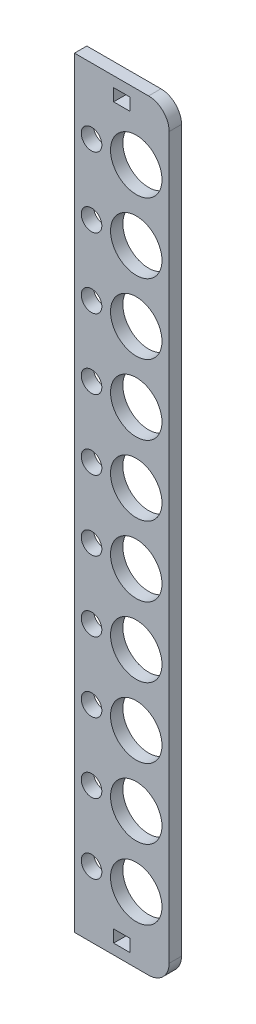
ISO-10303-21;
HEADER;
FILE_DESCRIPTION(('STEP AP214'),'2;1');
FILE_NAME('part.step','',(''),(''),'','','');
FILE_SCHEMA(('AUTOMOTIVE_DESIGN { 1 0 10303 214 1 1 1 1 }'));
ENDSEC;
DATA;
#1=APPLICATION_CONTEXT('core data for automotive mechanical design processes');
#2=APPLICATION_PROTOCOL_DEFINITION('international standard','automotive_design',2000,#1);
#3=PRODUCT_CONTEXT('',#1,'mechanical');
#4=PRODUCT('Part','Part','',(#3));
#5=PRODUCT_RELATED_PRODUCT_CATEGORY('part','',(#4));
#6=PRODUCT_DEFINITION_FORMATION('','',#4);
#7=PRODUCT_DEFINITION_CONTEXT('part definition',#1,'design');
#8=PRODUCT_DEFINITION('design','',#6,#7);
#9=PRODUCT_DEFINITION_SHAPE('','',#8);
#10=(LENGTH_UNIT() NAMED_UNIT(*) SI_UNIT(.MILLI.,.METRE.));
#11=(NAMED_UNIT(*) PLANE_ANGLE_UNIT() SI_UNIT($,.RADIAN.));
#12=(NAMED_UNIT(*) SI_UNIT($,.STERADIAN.) SOLID_ANGLE_UNIT());
#13=UNCERTAINTY_MEASURE_WITH_UNIT(LENGTH_MEASURE(1.E-05),#10,'distance_accuracy_value','');
#14=(GEOMETRIC_REPRESENTATION_CONTEXT(3) GLOBAL_UNCERTAINTY_ASSIGNED_CONTEXT((#13)) GLOBAL_UNIT_ASSIGNED_CONTEXT((#10,
#11,#12)) REPRESENTATION_CONTEXT('',''));
#15=CARTESIAN_POINT('',(0.,0.,0.));
#16=DIRECTION('',(0.,0.,1.));
#17=DIRECTION('',(1.,0.,0.));
#18=AXIS2_PLACEMENT_3D('',#15,#16,#17);
#19=CARTESIAN_POINT('',(0.,0.,6.));
#20=DIRECTION('',(0.,0.,-1.));
#21=DIRECTION('',(-1.,0.,0.));
#22=AXIS2_PLACEMENT_3D('',#19,#20,#21);
#23=PLANE('',#22);
#24=CARTESIAN_POINT('',(8.28114320263769,32.,6.));
#25=DIRECTION('',(0.,0.,1.));
#26=DIRECTION('',(1.,0.,0.));
#27=AXIS2_PLACEMENT_3D('',#24,#25,#26);
#28=CIRCLE('',#27,4.99999999999999);
#29=CARTESIAN_POINT('',(13.2811432026377,32.,6.));
#30=VERTEX_POINT('',#29);
#31=EDGE_CURVE('E607',#30,#30,#28,.T.);
#32=ORIENTED_EDGE('',*,*,#31,.F.);
#33=EDGE_LOOP('',(#32));
#34=FACE_BOUND('',#33,.T.);
#35=CARTESIAN_POINT('',(8.28114320263733,66.,6.));
#36=DIRECTION('',(0.,0.,1.));
#37=DIRECTION('',(1.,0.,0.));
#38=AXIS2_PLACEMENT_3D('',#35,#36,#37);
#39=CIRCLE('',#38,4.99999999999999);
#40=CARTESIAN_POINT('',(13.2811432026373,66.,6.));
#41=VERTEX_POINT('',#40);
#42=EDGE_CURVE('E609',#41,#41,#39,.T.);
#43=ORIENTED_EDGE('',*,*,#42,.F.);
#44=EDGE_LOOP('',(#43));
#45=FACE_BOUND('',#44,.T.);
#46=CARTESIAN_POINT('',(8.28114320263698,100.,6.));
#47=DIRECTION('',(0.,0.,1.));
#48=DIRECTION('',(1.,0.,0.));
#49=AXIS2_PLACEMENT_3D('',#46,#47,#48);
#50=CIRCLE('',#49,5.);
#51=CARTESIAN_POINT('',(13.281143202637,100.,6.));
#52=VERTEX_POINT('',#51);
#53=EDGE_CURVE('E615',#52,#52,#50,.T.);
#54=ORIENTED_EDGE('',*,*,#53,.F.);
#55=EDGE_LOOP('',(#54));
#56=FACE_BOUND('',#55,.T.);
#57=CARTESIAN_POINT('',(8.28114320263662,134.,6.));
#58=DIRECTION('',(0.,0.,1.));
#59=DIRECTION('',(1.,0.,0.));
#60=AXIS2_PLACEMENT_3D('',#57,#58,#59);
#61=CIRCLE('',#60,5.);
#62=CARTESIAN_POINT('',(13.2811432026366,134.,6.));
#63=VERTEX_POINT('',#62);
#64=EDGE_CURVE('E621',#63,#63,#61,.T.);
#65=ORIENTED_EDGE('',*,*,#64,.F.);
#66=EDGE_LOOP('',(#65));
#67=FACE_BOUND('',#66,.T.);
#68=CARTESIAN_POINT('',(8.28114320263627,168.,6.));
#69=DIRECTION('',(0.,0.,1.));
#70=DIRECTION('',(1.,0.,0.));
#71=AXIS2_PLACEMENT_3D('',#68,#69,#70);
#72=CIRCLE('',#71,5.);
#73=CARTESIAN_POINT('',(13.2811432026363,168.,6.));
#74=VERTEX_POINT('',#73);
#75=EDGE_CURVE('E627',#74,#74,#72,.T.);
#76=ORIENTED_EDGE('',*,*,#75,.F.);
#77=EDGE_LOOP('',(#76));
#78=FACE_BOUND('',#77,.T.);
#79=CARTESIAN_POINT('',(8.28114320263591,202.,6.));
#80=DIRECTION('',(0.,0.,1.));
#81=DIRECTION('',(1.,0.,0.));
#82=AXIS2_PLACEMENT_3D('',#79,#80,#81);
#83=CIRCLE('',#82,5.);
#84=CARTESIAN_POINT('',(13.2811432026359,202.,6.));
#85=VERTEX_POINT('',#84);
#86=EDGE_CURVE('E633',#85,#85,#83,.T.);
#87=ORIENTED_EDGE('',*,*,#86,.F.);
#88=EDGE_LOOP('',(#87));
#89=FACE_BOUND('',#88,.T.);
#90=CARTESIAN_POINT('',(8.28114320263555,236.,6.));
#91=DIRECTION('',(0.,0.,1.));
#92=DIRECTION('',(1.,0.,0.));
#93=AXIS2_PLACEMENT_3D('',#90,#91,#92);
#94=CIRCLE('',#93,5.);
#95=CARTESIAN_POINT('',(13.2811432026356,236.,6.));
#96=VERTEX_POINT('',#95);
#97=EDGE_CURVE('E639',#96,#96,#94,.T.);
#98=ORIENTED_EDGE('',*,*,#97,.F.);
#99=EDGE_LOOP('',(#98));
#100=FACE_BOUND('',#99,.T.);
#101=CARTESIAN_POINT('',(8.2811432026352,270.,6.));
#102=DIRECTION('',(0.,0.,1.));
#103=DIRECTION('',(1.,0.,0.));
#104=AXIS2_PLACEMENT_3D('',#101,#102,#103);
#105=CIRCLE('',#104,5.);
#106=CARTESIAN_POINT('',(13.2811432026352,270.,6.));
#107=VERTEX_POINT('',#106);
#108=EDGE_CURVE('E645',#107,#107,#105,.T.);
#109=ORIENTED_EDGE('',*,*,#108,.F.);
#110=EDGE_LOOP('',(#109));
#111=FACE_BOUND('',#110,.T.);
#112=CARTESIAN_POINT('',(8.28114320263484,304.,6.));
#113=DIRECTION('',(0.,0.,1.));
#114=DIRECTION('',(1.,0.,0.));
#115=AXIS2_PLACEMENT_3D('',#112,#113,#114);
#116=CIRCLE('',#115,5.);
#117=CARTESIAN_POINT('',(13.2811432026348,304.,6.));
#118=VERTEX_POINT('',#117);
#119=EDGE_CURVE('E651',#118,#118,#116,.T.);
#120=ORIENTED_EDGE('',*,*,#119,.F.);
#121=EDGE_LOOP('',(#120));
#122=FACE_BOUND('',#121,.T.);
#123=CARTESIAN_POINT('',(29.9999999999989,338.,6.));
#124=DIRECTION('',(0.,0.,1.));
#125=DIRECTION('',(1.,0.,0.));
#126=AXIS2_PLACEMENT_3D('',#123,#124,#125);
#127=CIRCLE('',#126,12.5);
#128=CARTESIAN_POINT('',(42.4999999999989,338.,6.));
#129=VERTEX_POINT('',#128);
#130=EDGE_CURVE('E657',#129,#129,#127,.T.);
#131=ORIENTED_EDGE('',*,*,#130,.F.);
#132=EDGE_LOOP('',(#131));
#133=FACE_BOUND('',#132,.T.);
#134=CARTESIAN_POINT('',(8.28114320263435,338.,6.));
#135=DIRECTION('',(0.,0.,1.));
#136=DIRECTION('',(1.,0.,0.));
#137=AXIS2_PLACEMENT_3D('',#134,#135,#136);
#138=CIRCLE('',#137,5.);
#139=CARTESIAN_POINT('',(13.2811432026343,338.,6.));
#140=VERTEX_POINT('',#139);
#141=EDGE_CURVE('E663',#140,#140,#138,.T.);
#142=ORIENTED_EDGE('',*,*,#141,.F.);
#143=EDGE_LOOP('',(#142));
#144=FACE_BOUND('',#143,.T.);
#145=CARTESIAN_POINT('',(29.999999999999,304.,6.));
#146=DIRECTION('',(0.,0.,1.));
#147=DIRECTION('',(1.,0.,0.));
#148=AXIS2_PLACEMENT_3D('',#145,#146,#147);
#149=CIRCLE('',#148,12.5);
#150=CARTESIAN_POINT('',(42.4999999999991,304.,6.));
#151=VERTEX_POINT('',#150);
#152=EDGE_CURVE('E669',#151,#151,#149,.T.);
#153=ORIENTED_EDGE('',*,*,#152,.F.);
#154=EDGE_LOOP('',(#153));
#155=FACE_BOUND('',#154,.T.);
#156=CARTESIAN_POINT('',(29.9999999999992,270.,6.));
#157=DIRECTION('',(0.,0.,1.));
#158=DIRECTION('',(1.,0.,0.));
#159=AXIS2_PLACEMENT_3D('',#156,#157,#158);
#160=CIRCLE('',#159,12.5);
#161=CARTESIAN_POINT('',(42.4999999999992,270.,6.));
#162=VERTEX_POINT('',#161);
#163=EDGE_CURVE('E675',#162,#162,#160,.T.);
#164=ORIENTED_EDGE('',*,*,#163,.F.);
#165=EDGE_LOOP('',(#164));
#166=FACE_BOUND('',#165,.T.);
#167=CARTESIAN_POINT('',(29.9999999999993,236.,6.));
#168=DIRECTION('',(0.,0.,1.));
#169=DIRECTION('',(1.,0.,0.));
#170=AXIS2_PLACEMENT_3D('',#167,#168,#169);
#171=CIRCLE('',#170,12.5);
#172=CARTESIAN_POINT('',(42.4999999999993,236.,6.));
#173=VERTEX_POINT('',#172);
#174=EDGE_CURVE('E681',#173,#173,#171,.T.);
#175=ORIENTED_EDGE('',*,*,#174,.F.);
#176=EDGE_LOOP('',(#175));
#177=FACE_BOUND('',#176,.T.);
#178=CARTESIAN_POINT('',(29.9999999999994,202.,6.));
#179=DIRECTION('',(0.,0.,1.));
#180=DIRECTION('',(1.,0.,0.));
#181=AXIS2_PLACEMENT_3D('',#178,#179,#180);
#182=CIRCLE('',#181,12.5);
#183=CARTESIAN_POINT('',(42.4999999999994,202.,6.));
#184=VERTEX_POINT('',#183);
#185=EDGE_CURVE('E687',#184,#184,#182,.T.);
#186=ORIENTED_EDGE('',*,*,#185,.F.);
#187=EDGE_LOOP('',(#186));
#188=FACE_BOUND('',#187,.T.);
#189=CARTESIAN_POINT('',(29.9999999999995,168.,6.));
#190=DIRECTION('',(0.,0.,1.));
#191=DIRECTION('',(1.,0.,0.));
#192=AXIS2_PLACEMENT_3D('',#189,#190,#191);
#193=CIRCLE('',#192,12.5);
#194=CARTESIAN_POINT('',(42.4999999999995,168.,6.));
#195=VERTEX_POINT('',#194);
#196=EDGE_CURVE('E693',#195,#195,#193,.T.);
#197=ORIENTED_EDGE('',*,*,#196,.F.);
#198=EDGE_LOOP('',(#197));
#199=FACE_BOUND('',#198,.T.);
#200=CARTESIAN_POINT('',(29.9999999999996,134.,6.));
#201=DIRECTION('',(0.,0.,1.));
#202=DIRECTION('',(1.,0.,0.));
#203=AXIS2_PLACEMENT_3D('',#200,#201,#202);
#204=CIRCLE('',#203,12.5);
#205=CARTESIAN_POINT('',(42.4999999999997,134.,6.));
#206=VERTEX_POINT('',#205);
#207=EDGE_CURVE('E699',#206,#206,#204,.T.);
#208=ORIENTED_EDGE('',*,*,#207,.F.);
#209=EDGE_LOOP('',(#208));
#210=FACE_BOUND('',#209,.T.);
#211=CARTESIAN_POINT('',(29.9999999999998,100.,6.));
#212=DIRECTION('',(0.,0.,1.));
#213=DIRECTION('',(1.,0.,0.));
#214=AXIS2_PLACEMENT_3D('',#211,#212,#213);
#215=CIRCLE('',#214,12.5);
#216=CARTESIAN_POINT('',(42.4999999999998,100.,6.));
#217=VERTEX_POINT('',#216);
#218=EDGE_CURVE('E705',#217,#217,#215,.T.);
#219=ORIENTED_EDGE('',*,*,#218,.F.);
#220=EDGE_LOOP('',(#219));
#221=FACE_BOUND('',#220,.T.);
#222=CARTESIAN_POINT('',(29.9999999999999,66.,6.));
#223=DIRECTION('',(0.,0.,1.));
#224=DIRECTION('',(1.,0.,0.));
#225=AXIS2_PLACEMENT_3D('',#222,#223,#224);
#226=CIRCLE('',#225,12.5);
#227=CARTESIAN_POINT('',(42.4999999999999,66.,6.));
#228=VERTEX_POINT('',#227);
#229=EDGE_CURVE('E711',#228,#228,#226,.T.);
#230=ORIENTED_EDGE('',*,*,#229,.F.);
#231=EDGE_LOOP('',(#230));
#232=FACE_BOUND('',#231,.T.);
#233=CARTESIAN_POINT('',(30.,32.,6.));
#234=DIRECTION('',(0.,0.,1.));
#235=DIRECTION('',(1.,0.,0.));
#236=AXIS2_PLACEMENT_3D('',#233,#234,#235);
#237=CIRCLE('',#236,12.5);
#238=CARTESIAN_POINT('',(42.5,32.,6.));
#239=VERTEX_POINT('',#238);
#240=EDGE_CURVE('E717',#239,#239,#237,.T.);
#241=ORIENTED_EDGE('',*,*,#240,.F.);
#242=EDGE_LOOP('',(#241));
#243=FACE_BOUND('',#242,.T.);
#244=DIRECTION('',(0.,-1.,0.));
#245=VECTOR('',#244,1.);
#246=CARTESIAN_POINT('',(19.,5.,6.));
#247=LINE('',#246,#245);
#248=CARTESIAN_POINT('',(19.,11.,6.));
#249=VERTEX_POINT('',#248);
#250=CARTESIAN_POINT('',(19.,5.,6.));
#251=VERTEX_POINT('',#250);
#252=EDGE_CURVE('E180',#249,#251,#247,.T.);
#253=ORIENTED_EDGE('',*,*,#252,.F.);
#254=DIRECTION('',(-1.,0.,0.));
#255=VECTOR('',#254,1.);
#256=CARTESIAN_POINT('',(19.,11.,6.));
#257=LINE('',#256,#255);
#258=CARTESIAN_POINT('',(27.,11.,6.));
#259=VERTEX_POINT('',#258);
#260=EDGE_CURVE('E188',#259,#249,#257,.T.);
#261=ORIENTED_EDGE('',*,*,#260,.F.);
#262=DIRECTION('',(0.,1.,0.));
#263=VECTOR('',#262,1.);
#264=CARTESIAN_POINT('',(27.,5.,6.));
#265=LINE('',#264,#263);
#266=CARTESIAN_POINT('',(27.,5.,6.));
#267=VERTEX_POINT('',#266);
#268=EDGE_CURVE('E185',#267,#259,#265,.T.);
#269=ORIENTED_EDGE('',*,*,#268,.F.);
#270=DIRECTION('',(1.,0.,0.));
#271=VECTOR('',#270,1.);
#272=CARTESIAN_POINT('',(19.,5.,6.));
#273=LINE('',#272,#271);
#274=EDGE_CURVE('E182',#251,#267,#273,.T.);
#275=ORIENTED_EDGE('',*,*,#274,.F.);
#276=EDGE_LOOP('',(#253,#261,#269,#275));
#277=FACE_BOUND('',#276,.T.);
#278=DIRECTION('',(1.,0.,0.));
#279=VECTOR('',#278,1.);
#280=CARTESIAN_POINT('',(0.,0.,6.));
#281=LINE('',#280,#279);
#282=CARTESIAN_POINT('',(0.,0.,6.));
#283=VERTEX_POINT('',#282);
#284=CARTESIAN_POINT('',(36.,0.,6.));
#285=VERTEX_POINT('',#284);
#286=EDGE_CURVE('E214',#283,#285,#281,.T.);
#287=ORIENTED_EDGE('',*,*,#286,.T.);
#288=CARTESIAN_POINT('',(36.,10.,6.));
#289=DIRECTION('',(0.,0.,-1.));
#290=DIRECTION('',(-1.,0.,0.));
#291=AXIS2_PLACEMENT_3D('',#288,#289,#290);
#292=CIRCLE('',#291,10.);
#293=CARTESIAN_POINT('',(46.,10.,6.));
#294=VERTEX_POINT('',#293);
#295=EDGE_CURVE('E41',#285,#294,#292,.F.);
#296=ORIENTED_EDGE('',*,*,#295,.T.);
#297=DIRECTION('',(0.,1.,0.));
#298=VECTOR('',#297,1.);
#299=CARTESIAN_POINT('',(46.,0.,6.));
#300=LINE('',#299,#298);
#301=CARTESIAN_POINT('',(46.,360.,6.));
#302=VERTEX_POINT('',#301);
#303=EDGE_CURVE('E217',#294,#302,#300,.T.);
#304=ORIENTED_EDGE('',*,*,#303,.T.);
#305=CARTESIAN_POINT('',(36.,360.,6.));
#306=DIRECTION('',(0.,0.,-1.));
#307=DIRECTION('',(-1.,0.,0.));
#308=AXIS2_PLACEMENT_3D('',#305,#306,#307);
#309=CIRCLE('',#308,10.);
#310=CARTESIAN_POINT('',(36.,370.,6.));
#311=VERTEX_POINT('',#310);
#312=EDGE_CURVE('E48',#302,#311,#309,.F.);
#313=ORIENTED_EDGE('',*,*,#312,.T.);
#314=DIRECTION('',(-1.,0.,0.));
#315=VECTOR('',#314,1.);
#316=CARTESIAN_POINT('',(0.,370.,6.));
#317=LINE('',#316,#315);
#318=CARTESIAN_POINT('',(0.,370.,6.));
#319=VERTEX_POINT('',#318);
#320=EDGE_CURVE('E219',#311,#319,#317,.T.);
#321=ORIENTED_EDGE('',*,*,#320,.T.);
#322=DIRECTION('',(0.,-1.,0.));
#323=VECTOR('',#322,1.);
#324=CARTESIAN_POINT('',(0.,0.,6.));
#325=LINE('',#324,#323);
#326=EDGE_CURVE('E211',#319,#283,#325,.T.);
#327=ORIENTED_EDGE('',*,*,#326,.T.);
#328=EDGE_LOOP('',(#287,#296,#304,#313,#321,#327));
#329=FACE_BOUND('',#328,.T.);
#330=DIRECTION('',(-1.,0.,0.));
#331=VECTOR('',#330,1.);
#332=CARTESIAN_POINT('',(19.,365.,6.));
#333=LINE('',#332,#331);
#334=CARTESIAN_POINT('',(27.,365.,6.));
#335=VERTEX_POINT('',#334);
#336=CARTESIAN_POINT('',(19.,365.,6.));
#337=VERTEX_POINT('',#336);
#338=EDGE_CURVE('E137',#335,#337,#333,.T.);
#339=ORIENTED_EDGE('',*,*,#338,.F.);
#340=DIRECTION('',(0.,1.,0.));
#341=VECTOR('',#340,1.);
#342=CARTESIAN_POINT('',(27.,365.,6.));
#343=LINE('',#342,#341);
#344=CARTESIAN_POINT('',(27.,359.,6.));
#345=VERTEX_POINT('',#344);
#346=EDGE_CURVE('E162',#345,#335,#343,.T.);
#347=ORIENTED_EDGE('',*,*,#346,.F.);
#348=DIRECTION('',(1.,0.,0.));
#349=VECTOR('',#348,1.);
#350=CARTESIAN_POINT('',(19.,359.,6.));
#351=LINE('',#350,#349);
#352=CARTESIAN_POINT('',(19.,359.,6.));
#353=VERTEX_POINT('',#352);
#354=EDGE_CURVE('E160',#353,#345,#351,.T.);
#355=ORIENTED_EDGE('',*,*,#354,.F.);
#356=DIRECTION('',(0.,-1.,0.));
#357=VECTOR('',#356,1.);
#358=CARTESIAN_POINT('',(19.,365.,6.));
#359=LINE('',#358,#357);
#360=EDGE_CURVE('E147',#337,#353,#359,.T.);
#361=ORIENTED_EDGE('',*,*,#360,.F.);
#362=EDGE_LOOP('',(#339,#347,#355,#361));
#363=FACE_BOUND('',#362,.T.);
#364=ADVANCED_FACE('F33',(#34,#45,#56,#67,#78,#89,#100,#111,#122,#133,#144,#155,#166,#177,#188,
#199,#210,#221,#232,#243,#277,#329,#363),#23,.F.);
#365=CARTESIAN_POINT('',(0.,0.,0.));
#366=DIRECTION('',(0.,0.,-1.));
#367=DIRECTION('',(-1.,0.,0.));
#368=AXIS2_PLACEMENT_3D('',#365,#366,#367);
#369=PLANE('',#368);
#370=CARTESIAN_POINT('',(8.28114320263769,32.,0.));
#371=DIRECTION('',(0.,0.,1.));
#372=DIRECTION('',(1.,0.,0.));
#373=AXIS2_PLACEMENT_3D('',#370,#371,#372);
#374=CIRCLE('',#373,4.99999999999999);
#375=CARTESIAN_POINT('',(13.2811432026377,32.,0.));
#376=VERTEX_POINT('',#375);
#377=EDGE_CURVE('E605',#376,#376,#374,.T.);
#378=ORIENTED_EDGE('',*,*,#377,.T.);
#379=EDGE_LOOP('',(#378));
#380=FACE_BOUND('',#379,.T.);
#381=CARTESIAN_POINT('',(8.28114320263733,66.,0.));
#382=DIRECTION('',(0.,0.,1.));
#383=DIRECTION('',(1.,0.,0.));
#384=AXIS2_PLACEMENT_3D('',#381,#382,#383);
#385=CIRCLE('',#384,4.99999999999999);
#386=CARTESIAN_POINT('',(13.2811432026373,66.,0.));
#387=VERTEX_POINT('',#386);
#388=EDGE_CURVE('E612',#387,#387,#385,.T.);
#389=ORIENTED_EDGE('',*,*,#388,.T.);
#390=EDGE_LOOP('',(#389));
#391=FACE_BOUND('',#390,.T.);
#392=CARTESIAN_POINT('',(8.28114320263698,100.,0.));
#393=DIRECTION('',(0.,0.,1.));
#394=DIRECTION('',(1.,0.,0.));
#395=AXIS2_PLACEMENT_3D('',#392,#393,#394);
#396=CIRCLE('',#395,5.);
#397=CARTESIAN_POINT('',(13.281143202637,100.,0.));
#398=VERTEX_POINT('',#397);
#399=EDGE_CURVE('E618',#398,#398,#396,.T.);
#400=ORIENTED_EDGE('',*,*,#399,.T.);
#401=EDGE_LOOP('',(#400));
#402=FACE_BOUND('',#401,.T.);
#403=CARTESIAN_POINT('',(8.28114320263662,134.,0.));
#404=DIRECTION('',(0.,0.,1.));
#405=DIRECTION('',(1.,0.,0.));
#406=AXIS2_PLACEMENT_3D('',#403,#404,#405);
#407=CIRCLE('',#406,5.);
#408=CARTESIAN_POINT('',(13.2811432026366,134.,0.));
#409=VERTEX_POINT('',#408);
#410=EDGE_CURVE('E624',#409,#409,#407,.T.);
#411=ORIENTED_EDGE('',*,*,#410,.T.);
#412=EDGE_LOOP('',(#411));
#413=FACE_BOUND('',#412,.T.);
#414=CARTESIAN_POINT('',(8.28114320263627,168.,0.));
#415=DIRECTION('',(0.,0.,1.));
#416=DIRECTION('',(1.,0.,0.));
#417=AXIS2_PLACEMENT_3D('',#414,#415,#416);
#418=CIRCLE('',#417,5.);
#419=CARTESIAN_POINT('',(13.2811432026363,168.,0.));
#420=VERTEX_POINT('',#419);
#421=EDGE_CURVE('E630',#420,#420,#418,.T.);
#422=ORIENTED_EDGE('',*,*,#421,.T.);
#423=EDGE_LOOP('',(#422));
#424=FACE_BOUND('',#423,.T.);
#425=CARTESIAN_POINT('',(8.28114320263591,202.,0.));
#426=DIRECTION('',(0.,0.,1.));
#427=DIRECTION('',(1.,0.,0.));
#428=AXIS2_PLACEMENT_3D('',#425,#426,#427);
#429=CIRCLE('',#428,5.);
#430=CARTESIAN_POINT('',(13.2811432026359,202.,0.));
#431=VERTEX_POINT('',#430);
#432=EDGE_CURVE('E636',#431,#431,#429,.T.);
#433=ORIENTED_EDGE('',*,*,#432,.T.);
#434=EDGE_LOOP('',(#433));
#435=FACE_BOUND('',#434,.T.);
#436=CARTESIAN_POINT('',(8.28114320263555,236.,0.));
#437=DIRECTION('',(0.,0.,1.));
#438=DIRECTION('',(1.,0.,0.));
#439=AXIS2_PLACEMENT_3D('',#436,#437,#438);
#440=CIRCLE('',#439,5.);
#441=CARTESIAN_POINT('',(13.2811432026356,236.,0.));
#442=VERTEX_POINT('',#441);
#443=EDGE_CURVE('E642',#442,#442,#440,.T.);
#444=ORIENTED_EDGE('',*,*,#443,.T.);
#445=EDGE_LOOP('',(#444));
#446=FACE_BOUND('',#445,.T.);
#447=CARTESIAN_POINT('',(8.2811432026352,270.,0.));
#448=DIRECTION('',(0.,0.,1.));
#449=DIRECTION('',(1.,0.,0.));
#450=AXIS2_PLACEMENT_3D('',#447,#448,#449);
#451=CIRCLE('',#450,5.);
#452=CARTESIAN_POINT('',(13.2811432026352,270.,0.));
#453=VERTEX_POINT('',#452);
#454=EDGE_CURVE('E648',#453,#453,#451,.T.);
#455=ORIENTED_EDGE('',*,*,#454,.T.);
#456=EDGE_LOOP('',(#455));
#457=FACE_BOUND('',#456,.T.);
#458=CARTESIAN_POINT('',(8.28114320263484,304.,0.));
#459=DIRECTION('',(0.,0.,1.));
#460=DIRECTION('',(1.,0.,0.));
#461=AXIS2_PLACEMENT_3D('',#458,#459,#460);
#462=CIRCLE('',#461,5.);
#463=CARTESIAN_POINT('',(13.2811432026348,304.,0.));
#464=VERTEX_POINT('',#463);
#465=EDGE_CURVE('E654',#464,#464,#462,.T.);
#466=ORIENTED_EDGE('',*,*,#465,.T.);
#467=EDGE_LOOP('',(#466));
#468=FACE_BOUND('',#467,.T.);
#469=CARTESIAN_POINT('',(29.9999999999989,338.,0.));
#470=DIRECTION('',(0.,0.,1.));
#471=DIRECTION('',(1.,0.,0.));
#472=AXIS2_PLACEMENT_3D('',#469,#470,#471);
#473=CIRCLE('',#472,12.5);
#474=CARTESIAN_POINT('',(42.4999999999989,338.,0.));
#475=VERTEX_POINT('',#474);
#476=EDGE_CURVE('E660',#475,#475,#473,.T.);
#477=ORIENTED_EDGE('',*,*,#476,.T.);
#478=EDGE_LOOP('',(#477));
#479=FACE_BOUND('',#478,.T.);
#480=CARTESIAN_POINT('',(8.28114320263435,338.,0.));
#481=DIRECTION('',(0.,0.,1.));
#482=DIRECTION('',(1.,0.,0.));
#483=AXIS2_PLACEMENT_3D('',#480,#481,#482);
#484=CIRCLE('',#483,5.);
#485=CARTESIAN_POINT('',(13.2811432026343,338.,0.));
#486=VERTEX_POINT('',#485);
#487=EDGE_CURVE('E666',#486,#486,#484,.T.);
#488=ORIENTED_EDGE('',*,*,#487,.T.);
#489=EDGE_LOOP('',(#488));
#490=FACE_BOUND('',#489,.T.);
#491=CARTESIAN_POINT('',(29.999999999999,304.,0.));
#492=DIRECTION('',(0.,0.,1.));
#493=DIRECTION('',(1.,0.,0.));
#494=AXIS2_PLACEMENT_3D('',#491,#492,#493);
#495=CIRCLE('',#494,12.5);
#496=CARTESIAN_POINT('',(42.4999999999991,304.,0.));
#497=VERTEX_POINT('',#496);
#498=EDGE_CURVE('E672',#497,#497,#495,.T.);
#499=ORIENTED_EDGE('',*,*,#498,.T.);
#500=EDGE_LOOP('',(#499));
#501=FACE_BOUND('',#500,.T.);
#502=CARTESIAN_POINT('',(29.9999999999992,270.,0.));
#503=DIRECTION('',(0.,0.,1.));
#504=DIRECTION('',(1.,0.,0.));
#505=AXIS2_PLACEMENT_3D('',#502,#503,#504);
#506=CIRCLE('',#505,12.5);
#507=CARTESIAN_POINT('',(42.4999999999992,270.,0.));
#508=VERTEX_POINT('',#507);
#509=EDGE_CURVE('E678',#508,#508,#506,.T.);
#510=ORIENTED_EDGE('',*,*,#509,.T.);
#511=EDGE_LOOP('',(#510));
#512=FACE_BOUND('',#511,.T.);
#513=CARTESIAN_POINT('',(29.9999999999993,236.,0.));
#514=DIRECTION('',(0.,0.,1.));
#515=DIRECTION('',(1.,0.,0.));
#516=AXIS2_PLACEMENT_3D('',#513,#514,#515);
#517=CIRCLE('',#516,12.5);
#518=CARTESIAN_POINT('',(42.4999999999993,236.,0.));
#519=VERTEX_POINT('',#518);
#520=EDGE_CURVE('E684',#519,#519,#517,.T.);
#521=ORIENTED_EDGE('',*,*,#520,.T.);
#522=EDGE_LOOP('',(#521));
#523=FACE_BOUND('',#522,.T.);
#524=CARTESIAN_POINT('',(29.9999999999994,202.,0.));
#525=DIRECTION('',(0.,0.,1.));
#526=DIRECTION('',(1.,0.,0.));
#527=AXIS2_PLACEMENT_3D('',#524,#525,#526);
#528=CIRCLE('',#527,12.5);
#529=CARTESIAN_POINT('',(42.4999999999994,202.,0.));
#530=VERTEX_POINT('',#529);
#531=EDGE_CURVE('E690',#530,#530,#528,.T.);
#532=ORIENTED_EDGE('',*,*,#531,.T.);
#533=EDGE_LOOP('',(#532));
#534=FACE_BOUND('',#533,.T.);
#535=CARTESIAN_POINT('',(29.9999999999995,168.,0.));
#536=DIRECTION('',(0.,0.,1.));
#537=DIRECTION('',(1.,0.,0.));
#538=AXIS2_PLACEMENT_3D('',#535,#536,#537);
#539=CIRCLE('',#538,12.5);
#540=CARTESIAN_POINT('',(42.4999999999995,168.,0.));
#541=VERTEX_POINT('',#540);
#542=EDGE_CURVE('E696',#541,#541,#539,.T.);
#543=ORIENTED_EDGE('',*,*,#542,.T.);
#544=EDGE_LOOP('',(#543));
#545=FACE_BOUND('',#544,.T.);
#546=CARTESIAN_POINT('',(29.9999999999996,134.,0.));
#547=DIRECTION('',(0.,0.,1.));
#548=DIRECTION('',(1.,0.,0.));
#549=AXIS2_PLACEMENT_3D('',#546,#547,#548);
#550=CIRCLE('',#549,12.5);
#551=CARTESIAN_POINT('',(42.4999999999997,134.,0.));
#552=VERTEX_POINT('',#551);
#553=EDGE_CURVE('E702',#552,#552,#550,.T.);
#554=ORIENTED_EDGE('',*,*,#553,.T.);
#555=EDGE_LOOP('',(#554));
#556=FACE_BOUND('',#555,.T.);
#557=CARTESIAN_POINT('',(29.9999999999998,100.,0.));
#558=DIRECTION('',(0.,0.,1.));
#559=DIRECTION('',(1.,0.,0.));
#560=AXIS2_PLACEMENT_3D('',#557,#558,#559);
#561=CIRCLE('',#560,12.5);
#562=CARTESIAN_POINT('',(42.4999999999998,100.,0.));
#563=VERTEX_POINT('',#562);
#564=EDGE_CURVE('E708',#563,#563,#561,.T.);
#565=ORIENTED_EDGE('',*,*,#564,.T.);
#566=EDGE_LOOP('',(#565));
#567=FACE_BOUND('',#566,.T.);
#568=CARTESIAN_POINT('',(29.9999999999999,66.,0.));
#569=DIRECTION('',(0.,0.,1.));
#570=DIRECTION('',(1.,0.,0.));
#571=AXIS2_PLACEMENT_3D('',#568,#569,#570);
#572=CIRCLE('',#571,12.5);
#573=CARTESIAN_POINT('',(42.4999999999999,66.,0.));
#574=VERTEX_POINT('',#573);
#575=EDGE_CURVE('E714',#574,#574,#572,.T.);
#576=ORIENTED_EDGE('',*,*,#575,.T.);
#577=EDGE_LOOP('',(#576));
#578=FACE_BOUND('',#577,.T.);
#579=CARTESIAN_POINT('',(30.,32.,0.));
#580=DIRECTION('',(0.,0.,1.));
#581=DIRECTION('',(1.,0.,0.));
#582=AXIS2_PLACEMENT_3D('',#579,#580,#581);
#583=CIRCLE('',#582,12.5);
#584=CARTESIAN_POINT('',(42.5,32.,0.));
#585=VERTEX_POINT('',#584);
#586=EDGE_CURVE('E169',#585,#585,#583,.T.);
#587=ORIENTED_EDGE('',*,*,#586,.T.);
#588=EDGE_LOOP('',(#587));
#589=FACE_BOUND('',#588,.T.);
#590=DIRECTION('',(-1.,0.,0.));
#591=VECTOR('',#590,1.);
#592=CARTESIAN_POINT('',(19.,11.,0.));
#593=LINE('',#592,#591);
#594=CARTESIAN_POINT('',(27.,11.,0.));
#595=VERTEX_POINT('',#594);
#596=CARTESIAN_POINT('',(19.,11.,0.));
#597=VERTEX_POINT('',#596);
#598=EDGE_CURVE('E183',#595,#597,#593,.T.);
#599=ORIENTED_EDGE('',*,*,#598,.T.);
#600=DIRECTION('',(0.,-1.,0.));
#601=VECTOR('',#600,1.);
#602=CARTESIAN_POINT('',(19.,5.,0.));
#603=LINE('',#602,#601);
#604=CARTESIAN_POINT('',(19.,5.,0.));
#605=VERTEX_POINT('',#604);
#606=EDGE_CURVE('E155',#597,#605,#603,.T.);
#607=ORIENTED_EDGE('',*,*,#606,.T.);
#608=DIRECTION('',(1.,0.,0.));
#609=VECTOR('',#608,1.);
#610=CARTESIAN_POINT('',(19.,5.,0.));
#611=LINE('',#610,#609);
#612=CARTESIAN_POINT('',(27.,5.,0.));
#613=VERTEX_POINT('',#612);
#614=EDGE_CURVE('E193',#605,#613,#611,.T.);
#615=ORIENTED_EDGE('',*,*,#614,.T.);
#616=DIRECTION('',(0.,1.,0.));
#617=VECTOR('',#616,1.);
#618=CARTESIAN_POINT('',(27.,5.,0.));
#619=LINE('',#618,#617);
#620=EDGE_CURVE('E196',#613,#595,#619,.T.);
#621=ORIENTED_EDGE('',*,*,#620,.T.);
#622=EDGE_LOOP('',(#599,#607,#615,#621));
#623=FACE_BOUND('',#622,.T.);
#624=DIRECTION('',(0.,1.,0.));
#625=VECTOR('',#624,1.);
#626=CARTESIAN_POINT('',(46.,0.,0.));
#627=LINE('',#626,#625);
#628=CARTESIAN_POINT('',(46.,10.,0.));
#629=VERTEX_POINT('',#628);
#630=CARTESIAN_POINT('',(46.,360.,0.));
#631=VERTEX_POINT('',#630);
#632=EDGE_CURVE('E226',#629,#631,#627,.T.);
#633=ORIENTED_EDGE('',*,*,#632,.F.);
#634=CARTESIAN_POINT('',(36.,10.,0.));
#635=DIRECTION('',(0.,0.,-1.));
#636=DIRECTION('',(-1.,0.,0.));
#637=AXIS2_PLACEMENT_3D('',#634,#635,#636);
#638=CIRCLE('',#637,10.);
#639=CARTESIAN_POINT('',(36.,0.,0.));
#640=VERTEX_POINT('',#639);
#641=EDGE_CURVE('E242',#629,#640,#638,.T.);
#642=ORIENTED_EDGE('',*,*,#641,.T.);
#643=DIRECTION('',(1.,0.,0.));
#644=VECTOR('',#643,1.);
#645=CARTESIAN_POINT('',(0.,0.,0.));
#646=LINE('',#645,#644);
#647=CARTESIAN_POINT('',(0.,0.,0.));
#648=VERTEX_POINT('',#647);
#649=EDGE_CURVE('E224',#648,#640,#646,.T.);
#650=ORIENTED_EDGE('',*,*,#649,.F.);
#651=DIRECTION('',(0.,-1.,0.));
#652=VECTOR('',#651,1.);
#653=CARTESIAN_POINT('',(0.,0.,0.));
#654=LINE('',#653,#652);
#655=CARTESIAN_POINT('',(0.,370.,0.));
#656=VERTEX_POINT('',#655);
#657=EDGE_CURVE('E210',#656,#648,#654,.T.);
#658=ORIENTED_EDGE('',*,*,#657,.F.);
#659=DIRECTION('',(-1.,0.,0.));
#660=VECTOR('',#659,1.);
#661=CARTESIAN_POINT('',(0.,370.,0.));
#662=LINE('',#661,#660);
#663=CARTESIAN_POINT('',(36.,370.,0.));
#664=VERTEX_POINT('',#663);
#665=EDGE_CURVE('E215',#664,#656,#662,.T.);
#666=ORIENTED_EDGE('',*,*,#665,.F.);
#667=CARTESIAN_POINT('',(36.,360.,0.));
#668=DIRECTION('',(0.,0.,-1.));
#669=DIRECTION('',(-1.,0.,0.));
#670=AXIS2_PLACEMENT_3D('',#667,#668,#669);
#671=CIRCLE('',#670,10.);
#672=EDGE_CURVE('E240',#664,#631,#671,.T.);
#673=ORIENTED_EDGE('',*,*,#672,.T.);
#674=EDGE_LOOP('',(#633,#642,#650,#658,#666,#673));
#675=FACE_BOUND('',#674,.T.);
#676=DIRECTION('',(0.,1.,0.));
#677=VECTOR('',#676,1.);
#678=CARTESIAN_POINT('',(27.,365.,0.));
#679=LINE('',#678,#677);
#680=CARTESIAN_POINT('',(27.,359.,0.));
#681=VERTEX_POINT('',#680);
#682=CARTESIAN_POINT('',(27.,365.,0.));
#683=VERTEX_POINT('',#682);
#684=EDGE_CURVE('E148',#681,#683,#679,.T.);
#685=ORIENTED_EDGE('',*,*,#684,.T.);
#686=DIRECTION('',(-1.,0.,0.));
#687=VECTOR('',#686,1.);
#688=CARTESIAN_POINT('',(19.,365.,0.));
#689=LINE('',#688,#687);
#690=CARTESIAN_POINT('',(19.,365.,0.));
#691=VERTEX_POINT('',#690);
#692=EDGE_CURVE('E167',#683,#691,#689,.T.);
#693=ORIENTED_EDGE('',*,*,#692,.T.);
#694=DIRECTION('',(0.,-1.,0.));
#695=VECTOR('',#694,1.);
#696=CARTESIAN_POINT('',(19.,365.,0.));
#697=LINE('',#696,#695);
#698=CARTESIAN_POINT('',(19.,359.,0.));
#699=VERTEX_POINT('',#698);
#700=EDGE_CURVE('E154',#691,#699,#697,.T.);
#701=ORIENTED_EDGE('',*,*,#700,.T.);
#702=DIRECTION('',(1.,0.,0.));
#703=VECTOR('',#702,1.);
#704=CARTESIAN_POINT('',(19.,359.,0.));
#705=LINE('',#704,#703);
#706=EDGE_CURVE('E171',#699,#681,#705,.T.);
#707=ORIENTED_EDGE('',*,*,#706,.T.);
#708=EDGE_LOOP('',(#685,#693,#701,#707));
#709=FACE_BOUND('',#708,.T.);
#710=ADVANCED_FACE('F255',(#380,#391,#402,#413,#424,#435,#446,#457,#468,#479,#490,#501,#512,
#523,#534,#545,#556,#567,#578,#589,#623,#675,#709),#369,.T.);
#711=CARTESIAN_POINT('',(0.,0.,6.));
#712=DIRECTION('',(1.,0.,0.));
#713=DIRECTION('',(0.,0.,-1.));
#714=AXIS2_PLACEMENT_3D('',#711,#712,#713);
#715=PLANE('',#714);
#716=ORIENTED_EDGE('',*,*,#657,.T.);
#717=DIRECTION('',(0.,0.,-1.));
#718=VECTOR('',#717,1.);
#719=CARTESIAN_POINT('',(0.,0.,6.));
#720=LINE('',#719,#718);
#721=EDGE_CURVE('E232',#283,#648,#720,.T.);
#722=ORIENTED_EDGE('',*,*,#721,.F.);
#723=ORIENTED_EDGE('',*,*,#326,.F.);
#724=DIRECTION('',(0.,0.,-1.));
#725=VECTOR('',#724,1.);
#726=CARTESIAN_POINT('',(0.,370.,6.));
#727=LINE('',#726,#725);
#728=EDGE_CURVE('E221',#319,#656,#727,.T.);
#729=ORIENTED_EDGE('',*,*,#728,.T.);
#730=EDGE_LOOP('',(#716,#722,#723,#729));
#731=FACE_BOUND('',#730,.T.);
#732=ADVANCED_FACE('F262',(#731),#715,.F.);
#733=CARTESIAN_POINT('',(0.,0.,6.));
#734=DIRECTION('',(0.,1.,0.));
#735=DIRECTION('',(0.,0.,1.));
#736=AXIS2_PLACEMENT_3D('',#733,#734,#735);
#737=PLANE('',#736);
#738=ORIENTED_EDGE('',*,*,#649,.T.);
#739=DIRECTION('',(0.,0.,-1.));
#740=VECTOR('',#739,1.);
#741=CARTESIAN_POINT('',(36.,0.,6.));
#742=LINE('',#741,#740);
#743=EDGE_CURVE('E56',#640,#285,#742,.F.);
#744=ORIENTED_EDGE('',*,*,#743,.T.);
#745=ORIENTED_EDGE('',*,*,#286,.F.);
#746=ORIENTED_EDGE('',*,*,#721,.T.);
#747=EDGE_LOOP('',(#738,#744,#745,#746));
#748=FACE_BOUND('',#747,.T.);
#749=ADVANCED_FACE('F258',(#748),#737,.F.);
#750=CARTESIAN_POINT('',(46.,0.,6.));
#751=DIRECTION('',(-1.,0.,0.));
#752=DIRECTION('',(0.,0.,1.));
#753=AXIS2_PLACEMENT_3D('',#750,#751,#752);
#754=PLANE('',#753);
#755=ORIENTED_EDGE('',*,*,#303,.F.);
#756=DIRECTION('',(0.,0.,-1.));
#757=VECTOR('',#756,1.);
#758=CARTESIAN_POINT('',(46.,10.,6.));
#759=LINE('',#758,#757);
#760=EDGE_CURVE('E237',#294,#629,#759,.T.);
#761=ORIENTED_EDGE('',*,*,#760,.T.);
#762=ORIENTED_EDGE('',*,*,#632,.T.);
#763=DIRECTION('',(0.,0.,-1.));
#764=VECTOR('',#763,1.);
#765=CARTESIAN_POINT('',(46.,360.,6.));
#766=LINE('',#765,#764);
#767=EDGE_CURVE('E235',#631,#302,#766,.F.);
#768=ORIENTED_EDGE('',*,*,#767,.T.);
#769=EDGE_LOOP('',(#755,#761,#762,#768));
#770=FACE_BOUND('',#769,.T.);
#771=ADVANCED_FACE('F250',(#770),#754,.F.);
#772=CARTESIAN_POINT('',(0.,370.,6.));
#773=DIRECTION('',(0.,-1.,0.));
#774=DIRECTION('',(0.,0.,-1.));
#775=AXIS2_PLACEMENT_3D('',#772,#773,#774);
#776=PLANE('',#775);
#777=ORIENTED_EDGE('',*,*,#320,.F.);
#778=DIRECTION('',(0.,0.,-1.));
#779=VECTOR('',#778,1.);
#780=CARTESIAN_POINT('',(36.,370.,6.));
#781=LINE('',#780,#779);
#782=EDGE_CURVE('E11',#311,#664,#781,.T.);
#783=ORIENTED_EDGE('',*,*,#782,.T.);
#784=ORIENTED_EDGE('',*,*,#665,.T.);
#785=ORIENTED_EDGE('',*,*,#728,.F.);
#786=EDGE_LOOP('',(#777,#783,#784,#785));
#787=FACE_BOUND('',#786,.T.);
#788=ADVANCED_FACE('F266',(#787),#776,.F.);
#789=CARTESIAN_POINT('',(19.,5.,6.));
#790=DIRECTION('',(1.,0.,0.));
#791=DIRECTION('',(0.,0.,-1.));
#792=AXIS2_PLACEMENT_3D('',#789,#790,#791);
#793=PLANE('',#792);
#794=ORIENTED_EDGE('',*,*,#606,.F.);
#795=DIRECTION('',(0.,0.,-1.));
#796=VECTOR('',#795,1.);
#797=CARTESIAN_POINT('',(19.,11.,6.));
#798=LINE('',#797,#796);
#799=EDGE_CURVE('E190',#249,#597,#798,.T.);
#800=ORIENTED_EDGE('',*,*,#799,.F.);
#801=ORIENTED_EDGE('',*,*,#252,.T.);
#802=DIRECTION('',(0.,0.,-1.));
#803=VECTOR('',#802,1.);
#804=CARTESIAN_POINT('',(19.,5.,6.));
#805=LINE('',#804,#803);
#806=EDGE_CURVE('E207',#251,#605,#805,.T.);
#807=ORIENTED_EDGE('',*,*,#806,.T.);
#808=EDGE_LOOP('',(#794,#800,#801,#807));
#809=FACE_BOUND('',#808,.T.);
#810=ADVANCED_FACE('F286',(#809),#793,.T.);
#811=CARTESIAN_POINT('',(19.,5.,6.));
#812=DIRECTION('',(0.,1.,0.));
#813=DIRECTION('',(0.,0.,1.));
#814=AXIS2_PLACEMENT_3D('',#811,#812,#813);
#815=PLANE('',#814);
#816=ORIENTED_EDGE('',*,*,#614,.F.);
#817=ORIENTED_EDGE('',*,*,#806,.F.);
#818=ORIENTED_EDGE('',*,*,#274,.T.);
#819=DIRECTION('',(0.,0.,-1.));
#820=VECTOR('',#819,1.);
#821=CARTESIAN_POINT('',(27.,5.,6.));
#822=LINE('',#821,#820);
#823=EDGE_CURVE('E205',#267,#613,#822,.T.);
#824=ORIENTED_EDGE('',*,*,#823,.T.);
#825=EDGE_LOOP('',(#816,#817,#818,#824));
#826=FACE_BOUND('',#825,.T.);
#827=ADVANCED_FACE('F327',(#826),#815,.T.);
#828=CARTESIAN_POINT('',(27.,5.,6.));
#829=DIRECTION('',(-1.,0.,0.));
#830=DIRECTION('',(0.,0.,1.));
#831=AXIS2_PLACEMENT_3D('',#828,#829,#830);
#832=PLANE('',#831);
#833=ORIENTED_EDGE('',*,*,#620,.F.);
#834=ORIENTED_EDGE('',*,*,#823,.F.);
#835=ORIENTED_EDGE('',*,*,#268,.T.);
#836=DIRECTION('',(0.,0.,-1.));
#837=VECTOR('',#836,1.);
#838=CARTESIAN_POINT('',(27.,11.,6.));
#839=LINE('',#838,#837);
#840=EDGE_CURVE('E203',#259,#595,#839,.T.);
#841=ORIENTED_EDGE('',*,*,#840,.T.);
#842=EDGE_LOOP('',(#833,#834,#835,#841));
#843=FACE_BOUND('',#842,.T.);
#844=ADVANCED_FACE('F333',(#843),#832,.T.);
#845=CARTESIAN_POINT('',(19.,11.,6.));
#846=DIRECTION('',(0.,-1.,0.));
#847=DIRECTION('',(0.,0.,-1.));
#848=AXIS2_PLACEMENT_3D('',#845,#846,#847);
#849=PLANE('',#848);
#850=ORIENTED_EDGE('',*,*,#598,.F.);
#851=ORIENTED_EDGE('',*,*,#840,.F.);
#852=ORIENTED_EDGE('',*,*,#260,.T.);
#853=ORIENTED_EDGE('',*,*,#799,.T.);
#854=EDGE_LOOP('',(#850,#851,#852,#853));
#855=FACE_BOUND('',#854,.T.);
#856=ADVANCED_FACE('F340',(#855),#849,.T.);
#857=CARTESIAN_POINT('',(19.,365.,6.));
#858=DIRECTION('',(0.,-1.,0.));
#859=DIRECTION('',(0.,0.,-1.));
#860=AXIS2_PLACEMENT_3D('',#857,#858,#859);
#861=PLANE('',#860);
#862=ORIENTED_EDGE('',*,*,#692,.F.);
#863=DIRECTION('',(0.,0.,-1.));
#864=VECTOR('',#863,1.);
#865=CARTESIAN_POINT('',(27.,365.,6.));
#866=LINE('',#865,#864);
#867=EDGE_CURVE('E143',#335,#683,#866,.T.);
#868=ORIENTED_EDGE('',*,*,#867,.F.);
#869=ORIENTED_EDGE('',*,*,#338,.T.);
#870=DIRECTION('',(0.,0.,-1.));
#871=VECTOR('',#870,1.);
#872=CARTESIAN_POINT('',(19.,365.,6.));
#873=LINE('',#872,#871);
#874=EDGE_CURVE('E140',#337,#691,#873,.T.);
#875=ORIENTED_EDGE('',*,*,#874,.T.);
#876=EDGE_LOOP('',(#862,#868,#869,#875));
#877=FACE_BOUND('',#876,.T.);
#878=ADVANCED_FACE('F139',(#877),#861,.T.);
#879=CARTESIAN_POINT('',(19.,365.,6.));
#880=DIRECTION('',(1.,0.,0.));
#881=DIRECTION('',(0.,0.,-1.));
#882=AXIS2_PLACEMENT_3D('',#879,#880,#881);
#883=PLANE('',#882);
#884=ORIENTED_EDGE('',*,*,#700,.F.);
#885=ORIENTED_EDGE('',*,*,#874,.F.);
#886=ORIENTED_EDGE('',*,*,#360,.T.);
#887=DIRECTION('',(0.,0.,-1.));
#888=VECTOR('',#887,1.);
#889=CARTESIAN_POINT('',(19.,359.,6.));
#890=LINE('',#889,#888);
#891=EDGE_CURVE('E156',#353,#699,#890,.T.);
#892=ORIENTED_EDGE('',*,*,#891,.T.);
#893=EDGE_LOOP('',(#884,#885,#886,#892));
#894=FACE_BOUND('',#893,.T.);
#895=ADVANCED_FACE('F151',(#894),#883,.T.);
#896=CARTESIAN_POINT('',(19.,359.,6.));
#897=DIRECTION('',(0.,1.,0.));
#898=DIRECTION('',(0.,0.,1.));
#899=AXIS2_PLACEMENT_3D('',#896,#897,#898);
#900=PLANE('',#899);
#901=ORIENTED_EDGE('',*,*,#706,.F.);
#902=ORIENTED_EDGE('',*,*,#891,.F.);
#903=ORIENTED_EDGE('',*,*,#354,.T.);
#904=DIRECTION('',(0.,0.,-1.));
#905=VECTOR('',#904,1.);
#906=CARTESIAN_POINT('',(27.,359.,6.));
#907=LINE('',#906,#905);
#908=EDGE_CURVE('E177',#345,#681,#907,.T.);
#909=ORIENTED_EDGE('',*,*,#908,.T.);
#910=EDGE_LOOP('',(#901,#902,#903,#909));
#911=FACE_BOUND('',#910,.T.);
#912=ADVANCED_FACE('F361',(#911),#900,.T.);
#913=CARTESIAN_POINT('',(27.,365.,6.));
#914=DIRECTION('',(-1.,0.,0.));
#915=DIRECTION('',(0.,0.,1.));
#916=AXIS2_PLACEMENT_3D('',#913,#914,#915);
#917=PLANE('',#916);
#918=ORIENTED_EDGE('',*,*,#684,.F.);
#919=ORIENTED_EDGE('',*,*,#908,.F.);
#920=ORIENTED_EDGE('',*,*,#346,.T.);
#921=ORIENTED_EDGE('',*,*,#867,.T.);
#922=EDGE_LOOP('',(#918,#919,#920,#921));
#923=FACE_BOUND('',#922,.T.);
#924=ADVANCED_FACE('F368',(#923),#917,.T.);
#925=CARTESIAN_POINT('',(30.,32.,0.));
#926=DIRECTION('',(0.,0.,1.));
#927=DIRECTION('',(1.,0.,0.));
#928=AXIS2_PLACEMENT_3D('',#925,#926,#927);
#929=CYLINDRICAL_SURFACE('',#928,12.5);
#930=ORIENTED_EDGE('',*,*,#586,.F.);
#931=EDGE_LOOP('',(#930));
#932=FACE_BOUND('',#931,.T.);
#933=ORIENTED_EDGE('',*,*,#240,.T.);
#934=EDGE_LOOP('',(#933));
#935=FACE_BOUND('',#934,.T.);
#936=ADVANCED_FACE('F376',(#932,#935),#929,.F.);
#937=CARTESIAN_POINT('',(29.9999999999999,66.,0.));
#938=DIRECTION('',(0.,0.,1.));
#939=DIRECTION('',(1.,0.,0.));
#940=AXIS2_PLACEMENT_3D('',#937,#938,#939);
#941=CYLINDRICAL_SURFACE('',#940,12.5);
#942=ORIENTED_EDGE('',*,*,#575,.F.);
#943=EDGE_LOOP('',(#942));
#944=FACE_BOUND('',#943,.T.);
#945=ORIENTED_EDGE('',*,*,#229,.T.);
#946=EDGE_LOOP('',(#945));
#947=FACE_BOUND('',#946,.T.);
#948=ADVANCED_FACE('F384',(#944,#947),#941,.F.);
#949=CARTESIAN_POINT('',(29.9999999999998,100.,0.));
#950=DIRECTION('',(0.,0.,1.));
#951=DIRECTION('',(1.,0.,0.));
#952=AXIS2_PLACEMENT_3D('',#949,#950,#951);
#953=CYLINDRICAL_SURFACE('',#952,12.5);
#954=ORIENTED_EDGE('',*,*,#564,.F.);
#955=EDGE_LOOP('',(#954));
#956=FACE_BOUND('',#955,.T.);
#957=ORIENTED_EDGE('',*,*,#218,.T.);
#958=EDGE_LOOP('',(#957));
#959=FACE_BOUND('',#958,.T.);
#960=ADVANCED_FACE('F392',(#956,#959),#953,.F.);
#961=CARTESIAN_POINT('',(29.9999999999996,134.,0.));
#962=DIRECTION('',(0.,0.,1.));
#963=DIRECTION('',(1.,0.,0.));
#964=AXIS2_PLACEMENT_3D('',#961,#962,#963);
#965=CYLINDRICAL_SURFACE('',#964,12.5);
#966=ORIENTED_EDGE('',*,*,#553,.F.);
#967=EDGE_LOOP('',(#966));
#968=FACE_BOUND('',#967,.T.);
#969=ORIENTED_EDGE('',*,*,#207,.T.);
#970=EDGE_LOOP('',(#969));
#971=FACE_BOUND('',#970,.T.);
#972=ADVANCED_FACE('F400',(#968,#971),#965,.F.);
#973=CARTESIAN_POINT('',(29.9999999999995,168.,0.));
#974=DIRECTION('',(0.,0.,1.));
#975=DIRECTION('',(1.,0.,0.));
#976=AXIS2_PLACEMENT_3D('',#973,#974,#975);
#977=CYLINDRICAL_SURFACE('',#976,12.5);
#978=ORIENTED_EDGE('',*,*,#542,.F.);
#979=EDGE_LOOP('',(#978));
#980=FACE_BOUND('',#979,.T.);
#981=ORIENTED_EDGE('',*,*,#196,.T.);
#982=EDGE_LOOP('',(#981));
#983=FACE_BOUND('',#982,.T.);
#984=ADVANCED_FACE('F408',(#980,#983),#977,.F.);
#985=CARTESIAN_POINT('',(29.9999999999994,202.,0.));
#986=DIRECTION('',(0.,0.,1.));
#987=DIRECTION('',(1.,0.,0.));
#988=AXIS2_PLACEMENT_3D('',#985,#986,#987);
#989=CYLINDRICAL_SURFACE('',#988,12.5);
#990=ORIENTED_EDGE('',*,*,#531,.F.);
#991=EDGE_LOOP('',(#990));
#992=FACE_BOUND('',#991,.T.);
#993=ORIENTED_EDGE('',*,*,#185,.T.);
#994=EDGE_LOOP('',(#993));
#995=FACE_BOUND('',#994,.T.);
#996=ADVANCED_FACE('F416',(#992,#995),#989,.F.);
#997=CARTESIAN_POINT('',(29.9999999999993,236.,0.));
#998=DIRECTION('',(0.,0.,1.));
#999=DIRECTION('',(1.,0.,0.));
#1000=AXIS2_PLACEMENT_3D('',#997,#998,#999);
#1001=CYLINDRICAL_SURFACE('',#1000,12.5);
#1002=ORIENTED_EDGE('',*,*,#520,.F.);
#1003=EDGE_LOOP('',(#1002));
#1004=FACE_BOUND('',#1003,.T.);
#1005=ORIENTED_EDGE('',*,*,#174,.T.);
#1006=EDGE_LOOP('',(#1005));
#1007=FACE_BOUND('',#1006,.T.);
#1008=ADVANCED_FACE('F424',(#1004,#1007),#1001,.F.);
#1009=CARTESIAN_POINT('',(29.9999999999992,270.,0.));
#1010=DIRECTION('',(0.,0.,1.));
#1011=DIRECTION('',(1.,0.,0.));
#1012=AXIS2_PLACEMENT_3D('',#1009,#1010,#1011);
#1013=CYLINDRICAL_SURFACE('',#1012,12.5);
#1014=ORIENTED_EDGE('',*,*,#509,.F.);
#1015=EDGE_LOOP('',(#1014));
#1016=FACE_BOUND('',#1015,.T.);
#1017=ORIENTED_EDGE('',*,*,#163,.T.);
#1018=EDGE_LOOP('',(#1017));
#1019=FACE_BOUND('',#1018,.T.);
#1020=ADVANCED_FACE('F432',(#1016,#1019),#1013,.F.);
#1021=CARTESIAN_POINT('',(29.999999999999,304.,0.));
#1022=DIRECTION('',(0.,0.,1.));
#1023=DIRECTION('',(1.,0.,0.));
#1024=AXIS2_PLACEMENT_3D('',#1021,#1022,#1023);
#1025=CYLINDRICAL_SURFACE('',#1024,12.5);
#1026=ORIENTED_EDGE('',*,*,#498,.F.);
#1027=EDGE_LOOP('',(#1026));
#1028=FACE_BOUND('',#1027,.T.);
#1029=ORIENTED_EDGE('',*,*,#152,.T.);
#1030=EDGE_LOOP('',(#1029));
#1031=FACE_BOUND('',#1030,.T.);
#1032=ADVANCED_FACE('F440',(#1028,#1031),#1025,.F.);
#1033=CARTESIAN_POINT('',(8.28114320263435,338.,0.));
#1034=DIRECTION('',(0.,0.,1.));
#1035=DIRECTION('',(1.,0.,0.));
#1036=AXIS2_PLACEMENT_3D('',#1033,#1034,#1035);
#1037=CYLINDRICAL_SURFACE('',#1036,5.);
#1038=ORIENTED_EDGE('',*,*,#487,.F.);
#1039=EDGE_LOOP('',(#1038));
#1040=FACE_BOUND('',#1039,.T.);
#1041=ORIENTED_EDGE('',*,*,#141,.T.);
#1042=EDGE_LOOP('',(#1041));
#1043=FACE_BOUND('',#1042,.T.);
#1044=ADVANCED_FACE('F448',(#1040,#1043),#1037,.F.);
#1045=CARTESIAN_POINT('',(29.9999999999989,338.,0.));
#1046=DIRECTION('',(0.,0.,1.));
#1047=DIRECTION('',(1.,0.,0.));
#1048=AXIS2_PLACEMENT_3D('',#1045,#1046,#1047);
#1049=CYLINDRICAL_SURFACE('',#1048,12.5);
#1050=ORIENTED_EDGE('',*,*,#476,.F.);
#1051=EDGE_LOOP('',(#1050));
#1052=FACE_BOUND('',#1051,.T.);
#1053=ORIENTED_EDGE('',*,*,#130,.T.);
#1054=EDGE_LOOP('',(#1053));
#1055=FACE_BOUND('',#1054,.T.);
#1056=ADVANCED_FACE('F456',(#1052,#1055),#1049,.F.);
#1057=CARTESIAN_POINT('',(8.28114320263484,304.,0.));
#1058=DIRECTION('',(0.,0.,1.));
#1059=DIRECTION('',(1.,0.,0.));
#1060=AXIS2_PLACEMENT_3D('',#1057,#1058,#1059);
#1061=CYLINDRICAL_SURFACE('',#1060,5.);
#1062=ORIENTED_EDGE('',*,*,#465,.F.);
#1063=EDGE_LOOP('',(#1062));
#1064=FACE_BOUND('',#1063,.T.);
#1065=ORIENTED_EDGE('',*,*,#119,.T.);
#1066=EDGE_LOOP('',(#1065));
#1067=FACE_BOUND('',#1066,.T.);
#1068=ADVANCED_FACE('F464',(#1064,#1067),#1061,.F.);
#1069=CARTESIAN_POINT('',(8.2811432026352,270.,0.));
#1070=DIRECTION('',(0.,0.,1.));
#1071=DIRECTION('',(1.,0.,0.));
#1072=AXIS2_PLACEMENT_3D('',#1069,#1070,#1071);
#1073=CYLINDRICAL_SURFACE('',#1072,5.);
#1074=ORIENTED_EDGE('',*,*,#454,.F.);
#1075=EDGE_LOOP('',(#1074));
#1076=FACE_BOUND('',#1075,.T.);
#1077=ORIENTED_EDGE('',*,*,#108,.T.);
#1078=EDGE_LOOP('',(#1077));
#1079=FACE_BOUND('',#1078,.T.);
#1080=ADVANCED_FACE('F472',(#1076,#1079),#1073,.F.);
#1081=CARTESIAN_POINT('',(8.28114320263555,236.,0.));
#1082=DIRECTION('',(0.,0.,1.));
#1083=DIRECTION('',(1.,0.,0.));
#1084=AXIS2_PLACEMENT_3D('',#1081,#1082,#1083);
#1085=CYLINDRICAL_SURFACE('',#1084,5.);
#1086=ORIENTED_EDGE('',*,*,#443,.F.);
#1087=EDGE_LOOP('',(#1086));
#1088=FACE_BOUND('',#1087,.T.);
#1089=ORIENTED_EDGE('',*,*,#97,.T.);
#1090=EDGE_LOOP('',(#1089));
#1091=FACE_BOUND('',#1090,.T.);
#1092=ADVANCED_FACE('F480',(#1088,#1091),#1085,.F.);
#1093=CARTESIAN_POINT('',(8.28114320263591,202.,0.));
#1094=DIRECTION('',(0.,0.,1.));
#1095=DIRECTION('',(1.,0.,0.));
#1096=AXIS2_PLACEMENT_3D('',#1093,#1094,#1095);
#1097=CYLINDRICAL_SURFACE('',#1096,5.);
#1098=ORIENTED_EDGE('',*,*,#432,.F.);
#1099=EDGE_LOOP('',(#1098));
#1100=FACE_BOUND('',#1099,.T.);
#1101=ORIENTED_EDGE('',*,*,#86,.T.);
#1102=EDGE_LOOP('',(#1101));
#1103=FACE_BOUND('',#1102,.T.);
#1104=ADVANCED_FACE('F488',(#1100,#1103),#1097,.F.);
#1105=CARTESIAN_POINT('',(8.28114320263627,168.,0.));
#1106=DIRECTION('',(0.,0.,1.));
#1107=DIRECTION('',(1.,0.,0.));
#1108=AXIS2_PLACEMENT_3D('',#1105,#1106,#1107);
#1109=CYLINDRICAL_SURFACE('',#1108,5.);
#1110=ORIENTED_EDGE('',*,*,#421,.F.);
#1111=EDGE_LOOP('',(#1110));
#1112=FACE_BOUND('',#1111,.T.);
#1113=ORIENTED_EDGE('',*,*,#75,.T.);
#1114=EDGE_LOOP('',(#1113));
#1115=FACE_BOUND('',#1114,.T.);
#1116=ADVANCED_FACE('F496',(#1112,#1115),#1109,.F.);
#1117=CARTESIAN_POINT('',(8.28114320263662,134.,0.));
#1118=DIRECTION('',(0.,0.,1.));
#1119=DIRECTION('',(1.,0.,0.));
#1120=AXIS2_PLACEMENT_3D('',#1117,#1118,#1119);
#1121=CYLINDRICAL_SURFACE('',#1120,5.);
#1122=ORIENTED_EDGE('',*,*,#410,.F.);
#1123=EDGE_LOOP('',(#1122));
#1124=FACE_BOUND('',#1123,.T.);
#1125=ORIENTED_EDGE('',*,*,#64,.T.);
#1126=EDGE_LOOP('',(#1125));
#1127=FACE_BOUND('',#1126,.T.);
#1128=ADVANCED_FACE('F504',(#1124,#1127),#1121,.F.);
#1129=CARTESIAN_POINT('',(8.28114320263698,100.,0.));
#1130=DIRECTION('',(0.,0.,1.));
#1131=DIRECTION('',(1.,0.,0.));
#1132=AXIS2_PLACEMENT_3D('',#1129,#1130,#1131);
#1133=CYLINDRICAL_SURFACE('',#1132,5.);
#1134=ORIENTED_EDGE('',*,*,#399,.F.);
#1135=EDGE_LOOP('',(#1134));
#1136=FACE_BOUND('',#1135,.T.);
#1137=ORIENTED_EDGE('',*,*,#53,.T.);
#1138=EDGE_LOOP('',(#1137));
#1139=FACE_BOUND('',#1138,.T.);
#1140=ADVANCED_FACE('F512',(#1136,#1139),#1133,.F.);
#1141=CARTESIAN_POINT('',(8.28114320263733,66.,0.));
#1142=DIRECTION('',(0.,0.,1.));
#1143=DIRECTION('',(1.,0.,0.));
#1144=AXIS2_PLACEMENT_3D('',#1141,#1142,#1143);
#1145=CYLINDRICAL_SURFACE('',#1144,4.99999999999999);
#1146=ORIENTED_EDGE('',*,*,#388,.F.);
#1147=EDGE_LOOP('',(#1146));
#1148=FACE_BOUND('',#1147,.T.);
#1149=ORIENTED_EDGE('',*,*,#42,.T.);
#1150=EDGE_LOOP('',(#1149));
#1151=FACE_BOUND('',#1150,.T.);
#1152=ADVANCED_FACE('F520',(#1148,#1151),#1145,.F.);
#1153=CARTESIAN_POINT('',(8.28114320263769,32.,0.));
#1154=DIRECTION('',(0.,0.,1.));
#1155=DIRECTION('',(1.,0.,0.));
#1156=AXIS2_PLACEMENT_3D('',#1153,#1154,#1155);
#1157=CYLINDRICAL_SURFACE('',#1156,4.99999999999999);
#1158=ORIENTED_EDGE('',*,*,#377,.F.);
#1159=EDGE_LOOP('',(#1158));
#1160=FACE_BOUND('',#1159,.T.);
#1161=ORIENTED_EDGE('',*,*,#31,.T.);
#1162=EDGE_LOOP('',(#1161));
#1163=FACE_BOUND('',#1162,.T.);
#1164=ADVANCED_FACE('F273',(#1160,#1163),#1157,.F.);
#1165=CARTESIAN_POINT('',(36.,10.,6.));
#1166=DIRECTION('',(0.,0.,-1.));
#1167=DIRECTION('',(-1.,0.,0.));
#1168=AXIS2_PLACEMENT_3D('',#1165,#1166,#1167);
#1169=CYLINDRICAL_SURFACE('',#1168,10.);
#1170=ORIENTED_EDGE('',*,*,#295,.F.);
#1171=ORIENTED_EDGE('',*,*,#743,.F.);
#1172=ORIENTED_EDGE('',*,*,#641,.F.);
#1173=ORIENTED_EDGE('',*,*,#760,.F.);
#1174=EDGE_LOOP('',(#1170,#1171,#1172,#1173));
#1175=FACE_BOUND('',#1174,.T.);
#1176=ADVANCED_FACE('F253',(#1175),#1169,.T.);
#1177=CARTESIAN_POINT('',(36.,360.,6.));
#1178=DIRECTION('',(0.,0.,-1.));
#1179=DIRECTION('',(-1.,0.,0.));
#1180=AXIS2_PLACEMENT_3D('',#1177,#1178,#1179);
#1181=CYLINDRICAL_SURFACE('',#1180,10.);
#1182=ORIENTED_EDGE('',*,*,#312,.F.);
#1183=ORIENTED_EDGE('',*,*,#767,.F.);
#1184=ORIENTED_EDGE('',*,*,#672,.F.);
#1185=ORIENTED_EDGE('',*,*,#782,.F.);
#1186=EDGE_LOOP('',(#1182,#1183,#1184,#1185));
#1187=FACE_BOUND('',#1186,.T.);
#1188=ADVANCED_FACE('F35',(#1187),#1181,.T.);
#1189=CLOSED_SHELL('',(#364,#710,#732,#749,#771,#788,#810,#827,#844,#856,#878,#895,#912,#924,
#936,#948,#960,#972,#984,#996,#1008,#1020,#1032,#1044,#1056,#1068,#1080,#1092,#1104,#1116,#1128,
#1140,#1152,#1164,#1176,#1188));
#1190=MANIFOLD_SOLID_BREP('B2',#1189);
#1191=ADVANCED_BREP_SHAPE_REPRESENTATION('',(#18,#1190),#14);
#1192=SHAPE_DEFINITION_REPRESENTATION(#9,#1191);
ENDSEC;
END-ISO-10303-21;
